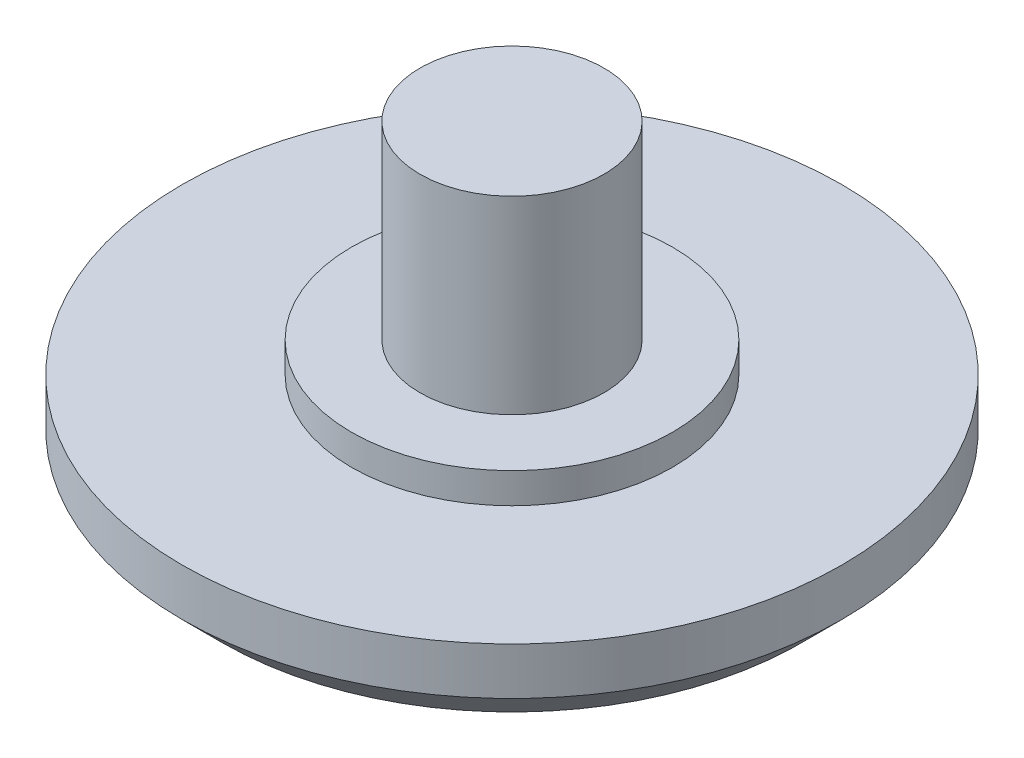
ISO-10303-21;
HEADER;
FILE_DESCRIPTION(('STEP AP214'),'2;1');
FILE_NAME('part.step','',(''),(''),'','','');
FILE_SCHEMA(('AUTOMOTIVE_DESIGN { 1 0 10303 214 1 1 1 1 }'));
ENDSEC;
DATA;
#1=APPLICATION_CONTEXT('core data for automotive mechanical design processes');
#2=APPLICATION_PROTOCOL_DEFINITION('international standard','automotive_design',2000,#1);
#3=PRODUCT_CONTEXT('',#1,'mechanical');
#4=PRODUCT('Part','Part','',(#3));
#5=PRODUCT_RELATED_PRODUCT_CATEGORY('part','',(#4));
#6=PRODUCT_DEFINITION_FORMATION('','',#4);
#7=PRODUCT_DEFINITION_CONTEXT('part definition',#1,'design');
#8=PRODUCT_DEFINITION('design','',#6,#7);
#9=PRODUCT_DEFINITION_SHAPE('','',#8);
#10=(LENGTH_UNIT() NAMED_UNIT(*) SI_UNIT(.MILLI.,.METRE.));
#11=(NAMED_UNIT(*) PLANE_ANGLE_UNIT() SI_UNIT($,.RADIAN.));
#12=(NAMED_UNIT(*) SI_UNIT($,.STERADIAN.) SOLID_ANGLE_UNIT());
#13=UNCERTAINTY_MEASURE_WITH_UNIT(LENGTH_MEASURE(1.E-05),#10,'distance_accuracy_value','');
#14=(GEOMETRIC_REPRESENTATION_CONTEXT(3) GLOBAL_UNCERTAINTY_ASSIGNED_CONTEXT((#13)) GLOBAL_UNIT_ASSIGNED_CONTEXT((#10,
#11,#12)) REPRESENTATION_CONTEXT('',''));
#15=CARTESIAN_POINT('',(0.,0.,0.));
#16=DIRECTION('',(0.,0.,1.));
#17=DIRECTION('',(1.,0.,0.));
#18=AXIS2_PLACEMENT_3D('',#15,#16,#17);
#19=CARTESIAN_POINT('',(0.,-21.0979427319702,0.));
#20=DIRECTION('',(0.,1.,0.));
#21=DIRECTION('',(0.,0.,1.));
#22=AXIS2_PLACEMENT_3D('',#19,#20,#21);
#23=CYLINDRICAL_SURFACE('',#22,2.3);
#24=CARTESIAN_POINT('',(0.,2.94,0.));
#25=DIRECTION('',(0.,1.,0.));
#26=DIRECTION('',(0.,0.,1.));
#27=AXIS2_PLACEMENT_3D('',#24,#25,#26);
#28=CIRCLE('',#27,2.3);
#29=CARTESIAN_POINT('',(0.,2.94,2.3));
#30=VERTEX_POINT('',#29);
#31=EDGE_CURVE('E62',#30,#30,#28,.F.);
#32=CARTESIAN_POINT('',(0.,7.67,0.));
#33=DIRECTION('',(0.,1.,0.));
#34=DIRECTION('',(0.,0.,1.));
#35=AXIS2_PLACEMENT_3D('',#32,#33,#34);
#36=CIRCLE('',#35,2.3);
#37=CARTESIAN_POINT('',(0.,7.67,2.3));
#38=VERTEX_POINT('',#37);
#39=EDGE_CURVE('E65',#38,#38,#36,.T.);
#40=CARTESIAN_POINT('',(0.,2.94,2.3));
#41=CARTESIAN_POINT('',(0.,2.98927083333333,2.3));
#42=CARTESIAN_POINT('',(0.,3.03854166666666,2.3));
#43=CARTESIAN_POINT('',(0.,3.13708333333333,2.3));
#44=CARTESIAN_POINT('',(0.,3.18635416666667,2.3));
#45=CARTESIAN_POINT('',(0.,3.28489583333333,2.3));
#46=CARTESIAN_POINT('',(0.,3.33416666666667,2.3));
#47=CARTESIAN_POINT('',(0.,3.43270833333333,2.3));
#48=CARTESIAN_POINT('',(0.,3.48197916666667,2.3));
#49=CARTESIAN_POINT('',(0.,3.58052083333333,2.3));
#50=CARTESIAN_POINT('',(0.,3.62979166666667,2.3));
#51=CARTESIAN_POINT('',(0.,3.72833333333333,2.3));
#52=CARTESIAN_POINT('',(0.,3.77760416666667,2.3));
#53=CARTESIAN_POINT('',(0.,3.87614583333333,2.3));
#54=CARTESIAN_POINT('',(0.,3.92541666666667,2.3));
#55=CARTESIAN_POINT('',(0.,4.02395833333333,2.3));
#56=CARTESIAN_POINT('',(0.,4.07322916666667,2.3));
#57=CARTESIAN_POINT('',(0.,4.17177083333333,2.3));
#58=CARTESIAN_POINT('',(0.,4.22104166666667,2.3));
#59=CARTESIAN_POINT('',(0.,4.31958333333333,2.3));
#60=CARTESIAN_POINT('',(0.,4.36885416666667,2.3));
#61=CARTESIAN_POINT('',(0.,4.46739583333333,2.3));
#62=CARTESIAN_POINT('',(0.,4.51666666666667,2.3));
#63=CARTESIAN_POINT('',(0.,4.61520833333333,2.3));
#64=CARTESIAN_POINT('',(0.,4.66447916666667,2.3));
#65=CARTESIAN_POINT('',(0.,4.76302083333333,2.3));
#66=CARTESIAN_POINT('',(0.,4.81229166666667,2.3));
#67=CARTESIAN_POINT('',(0.,4.91083333333333,2.3));
#68=CARTESIAN_POINT('',(0.,4.96010416666667,2.3));
#69=CARTESIAN_POINT('',(0.,5.05864583333333,2.3));
#70=CARTESIAN_POINT('',(0.,5.10791666666667,2.3));
#71=CARTESIAN_POINT('',(0.,5.20645833333333,2.3));
#72=CARTESIAN_POINT('',(0.,5.25572916666667,2.3));
#73=CARTESIAN_POINT('',(0.,5.35427083333333,2.3));
#74=CARTESIAN_POINT('',(0.,5.40354166666667,2.3));
#75=CARTESIAN_POINT('',(0.,5.50208333333333,2.3));
#76=CARTESIAN_POINT('',(0.,5.55135416666667,2.3));
#77=CARTESIAN_POINT('',(0.,5.64989583333333,2.3));
#78=CARTESIAN_POINT('',(0.,5.69916666666667,2.3));
#79=CARTESIAN_POINT('',(0.,5.79770833333334,2.3));
#80=CARTESIAN_POINT('',(0.,5.84697916666667,2.3));
#81=CARTESIAN_POINT('',(0.,5.94552083333334,2.3));
#82=CARTESIAN_POINT('',(0.,5.99479166666667,2.3));
#83=CARTESIAN_POINT('',(0.,6.09333333333334,2.3));
#84=CARTESIAN_POINT('',(0.,6.14260416666667,2.3));
#85=CARTESIAN_POINT('',(0.,6.24114583333334,2.3));
#86=CARTESIAN_POINT('',(0.,6.29041666666667,2.3));
#87=CARTESIAN_POINT('',(0.,6.38895833333334,2.3));
#88=CARTESIAN_POINT('',(0.,6.43822916666667,2.3));
#89=CARTESIAN_POINT('',(0.,6.53677083333333,2.3));
#90=CARTESIAN_POINT('',(0.,6.58604166666667,2.3));
#91=CARTESIAN_POINT('',(0.,6.68458333333334,2.3));
#92=CARTESIAN_POINT('',(0.,6.73385416666667,2.3));
#93=CARTESIAN_POINT('',(0.,6.83239583333333,2.3));
#94=CARTESIAN_POINT('',(0.,6.88166666666667,2.3));
#95=CARTESIAN_POINT('',(0.,6.98020833333333,2.3));
#96=CARTESIAN_POINT('',(0.,7.02947916666667,2.3));
#97=CARTESIAN_POINT('',(0.,7.12802083333334,2.3));
#98=CARTESIAN_POINT('',(0.,7.17729166666667,2.3));
#99=CARTESIAN_POINT('',(0.,7.27583333333334,2.3));
#100=CARTESIAN_POINT('',(0.,7.32510416666667,2.3));
#101=CARTESIAN_POINT('',(0.,7.42364583333334,2.3));
#102=CARTESIAN_POINT('',(0.,7.47291666666667,2.3));
#103=CARTESIAN_POINT('',(0.,7.57145833333334,2.3));
#104=CARTESIAN_POINT('',(0.,7.62072916666667,2.3));
#105=CARTESIAN_POINT('',(0.,7.67,2.3));
#106=B_SPLINE_CURVE_WITH_KNOTS('',3,(#40,#41,#42,#43,#44,#45,#46,#47,#48,#49,#50,#51,#52,#53,
#54,#55,#56,#57,#58,#59,#60,#61,#62,#63,#64,#65,#66,#67,#68,#69,#70,#71,#72,#73,#74,#75,#76,#77,
#78,#79,#80,#81,#82,#83,#84,#85,#86,#87,#88,#89,#90,#91,#92,#93,#94,#95,#96,#97,#98,#99,#100,
#101,#102,#103,#104,#105),.UNSPECIFIED.,.F.,.F.,(4,2,2,2,2,2,2,2,2,2,2,2,2,2,2,2,2,2,2,2,2,2,2,
2,2,2,2,2,2,2,2,2,4),(0.,0.1478125,0.295625000000001,0.443437500000001,0.591250000000001,
0.739062500000002,0.886875000000002,1.0346875,1.1825,1.3303125,1.478125,1.6259375,1.77375,
1.9215625,2.069375,2.2171875,2.365,2.5128125,2.660625,2.8084375,2.95625,3.1040625,3.251875,
3.39968750000001,3.5475,3.69531250000001,3.843125,3.9909375,4.13875,4.2865625,4.434375,
4.5821875,4.73),.UNSPECIFIED.);
#107=EDGE_CURVE('BSEAM35',#30,#38,#106,.T.);
#108=ORIENTED_EDGE('',*,*,#31,.F.);
#109=ORIENTED_EDGE('',*,*,#39,.F.);
#110=ORIENTED_EDGE('',*,*,#107,.T.);
#111=ORIENTED_EDGE('',*,*,#107,.F.);
#112=EDGE_LOOP('',(#108,#110,#109,#111));
#113=FACE_BOUND('',#112,.T.);
#114=ADVANCED_FACE('F35',(#113),#23,.T.);
#115=CARTESIAN_POINT('',(0.,3.54,0.));
#116=DIRECTION('',(0.,-1.,0.));
#117=DIRECTION('',(0.,0.,-1.));
#118=AXIS2_PLACEMENT_3D('',#115,#116,#117);
#119=CYLINDRICAL_SURFACE('',#118,4.01);
#120=CARTESIAN_POINT('',(0.,2.18,0.));
#121=DIRECTION('',(0.,1.,0.));
#122=DIRECTION('',(0.,0.,1.));
#123=AXIS2_PLACEMENT_3D('',#120,#121,#122);
#124=CIRCLE('',#123,4.01);
#125=CARTESIAN_POINT('',(0.,2.18,4.01));
#126=VERTEX_POINT('',#125);
#127=EDGE_CURVE('E11',#126,#126,#124,.T.);
#128=ORIENTED_EDGE('',*,*,#127,.T.);
#129=EDGE_LOOP('',(#128));
#130=FACE_BOUND('',#129,.T.);
#131=CARTESIAN_POINT('',(0.,2.94,0.));
#132=DIRECTION('',(0.,1.,0.));
#133=DIRECTION('',(0.,0.,1.));
#134=AXIS2_PLACEMENT_3D('',#131,#132,#133);
#135=CIRCLE('',#134,4.01);
#136=CARTESIAN_POINT('',(0.,2.94,4.01));
#137=VERTEX_POINT('',#136);
#138=EDGE_CURVE('E59',#137,#137,#135,.T.);
#139=ORIENTED_EDGE('',*,*,#138,.F.);
#140=EDGE_LOOP('',(#139));
#141=FACE_BOUND('',#140,.T.);
#142=ADVANCED_FACE('F72',(#130,#141),#119,.T.);
#143=CARTESIAN_POINT('',(0.,2.18,0.));
#144=DIRECTION('',(0.,-1.,0.));
#145=DIRECTION('',(0.,0.,-1.));
#146=AXIS2_PLACEMENT_3D('',#143,#144,#145);
#147=CYLINDRICAL_SURFACE('',#146,8.24);
#148=CARTESIAN_POINT('',(0.,2.18,0.));
#149=DIRECTION('',(0.,1.,0.));
#150=DIRECTION('',(0.,0.,1.));
#151=AXIS2_PLACEMENT_3D('',#148,#149,#150);
#152=CIRCLE('',#151,8.24);
#153=CARTESIAN_POINT('',(0.,2.18,8.24));
#154=VERTEX_POINT('',#153);
#155=EDGE_CURVE('E39',#154,#154,#152,.T.);
#156=ORIENTED_EDGE('',*,*,#155,.F.);
#157=EDGE_LOOP('',(#156));
#158=FACE_BOUND('',#157,.T.);
#159=CARTESIAN_POINT('',(0.,1.,0.));
#160=DIRECTION('',(0.,1.,0.));
#161=DIRECTION('',(0.,0.,1.));
#162=AXIS2_PLACEMENT_3D('',#159,#160,#161);
#163=CIRCLE('',#162,8.24);
#164=CARTESIAN_POINT('',(0.,1.,8.24));
#165=VERTEX_POINT('',#164);
#166=EDGE_CURVE('E53',#165,#165,#163,.T.);
#167=ORIENTED_EDGE('',*,*,#166,.T.);
#168=EDGE_LOOP('',(#167));
#169=FACE_BOUND('',#168,.T.);
#170=ADVANCED_FACE('F37',(#158,#169),#147,.T.);
#171=CARTESIAN_POINT('',(0.,2.18,0.));
#172=DIRECTION('',(0.,1.,0.));
#173=DIRECTION('',(0.,0.,1.));
#174=AXIS2_PLACEMENT_3D('',#171,#172,#173);
#175=PLANE('',#174);
#176=ORIENTED_EDGE('',*,*,#127,.F.);
#177=EDGE_LOOP('',(#176));
#178=FACE_BOUND('',#177,.T.);
#179=ORIENTED_EDGE('',*,*,#155,.T.);
#180=EDGE_LOOP('',(#179));
#181=FACE_BOUND('',#180,.T.);
#182=ADVANCED_FACE('F91',(#178,#181),#175,.T.);
#183=CARTESIAN_POINT('',(0.,1.,0.));
#184=DIRECTION('',(0.,1.,0.));
#185=DIRECTION('',(0.,0.,1.));
#186=AXIS2_PLACEMENT_3D('',#183,#184,#185);
#187=CONICAL_SURFACE('',#186,8.24,0.785398163397448);
#188=CARTESIAN_POINT('',(0.,0.,0.));
#189=DIRECTION('',(0.,1.,0.));
#190=DIRECTION('',(0.,0.,1.));
#191=AXIS2_PLACEMENT_3D('',#188,#189,#190);
#192=CIRCLE('',#191,7.24);
#193=CARTESIAN_POINT('',(0.,0.,7.24));
#194=VERTEX_POINT('',#193);
#195=EDGE_CURVE('E56',#194,#194,#192,.T.);
#196=ORIENTED_EDGE('',*,*,#195,.T.);
#197=EDGE_LOOP('',(#196));
#198=FACE_BOUND('',#197,.T.);
#199=ORIENTED_EDGE('',*,*,#166,.F.);
#200=EDGE_LOOP('',(#199));
#201=FACE_BOUND('',#200,.T.);
#202=ADVANCED_FACE('F87',(#198,#201),#187,.T.);
#203=CARTESIAN_POINT('',(0.,0.4,0.));
#204=DIRECTION('',(0.,-1.,0.));
#205=DIRECTION('',(0.,0.,-1.));
#206=AXIS2_PLACEMENT_3D('',#203,#204,#205);
#207=PLANE('',#206);
#208=CARTESIAN_POINT('',(0.,0.4,0.));
#209=DIRECTION('',(0.,1.,0.));
#210=DIRECTION('',(0.,0.,1.));
#211=AXIS2_PLACEMENT_3D('',#208,#209,#210);
#212=CIRCLE('',#211,5.6);
#213=CARTESIAN_POINT('',(0.,0.4,5.6));
#214=VERTEX_POINT('',#213);
#215=EDGE_CURVE('E46',#214,#214,#212,.T.);
#216=ORIENTED_EDGE('',*,*,#215,.F.);
#217=EDGE_LOOP('',(#216));
#218=FACE_BOUND('',#217,.T.);
#219=ADVANCED_FACE('F90',(#218),#207,.T.);
#220=CARTESIAN_POINT('',(0.,0.,0.));
#221=DIRECTION('',(0.,-1.,0.));
#222=DIRECTION('',(0.,0.,-1.));
#223=AXIS2_PLACEMENT_3D('',#220,#221,#222);
#224=CONICAL_SURFACE('',#223,6.6,1.19028994968253);
#225=ORIENTED_EDGE('',*,*,#215,.T.);
#226=EDGE_LOOP('',(#225));
#227=FACE_BOUND('',#226,.T.);
#228=CARTESIAN_POINT('',(0.,0.,0.));
#229=DIRECTION('',(0.,1.,0.));
#230=DIRECTION('',(0.,0.,1.));
#231=AXIS2_PLACEMENT_3D('',#228,#229,#230);
#232=CIRCLE('',#231,6.6);
#233=CARTESIAN_POINT('',(0.,0.,6.6));
#234=VERTEX_POINT('',#233);
#235=EDGE_CURVE('E50',#234,#234,#232,.T.);
#236=ORIENTED_EDGE('',*,*,#235,.F.);
#237=EDGE_LOOP('',(#236));
#238=FACE_BOUND('',#237,.T.);
#239=ADVANCED_FACE('F93',(#227,#238),#224,.F.);
#240=CARTESIAN_POINT('',(0.,0.,0.));
#241=DIRECTION('',(0.,1.,0.));
#242=DIRECTION('',(0.,0.,1.));
#243=AXIS2_PLACEMENT_3D('',#240,#241,#242);
#244=PLANE('',#243);
#245=ORIENTED_EDGE('',*,*,#235,.T.);
#246=EDGE_LOOP('',(#245));
#247=FACE_BOUND('',#246,.T.);
#248=ORIENTED_EDGE('',*,*,#195,.F.);
#249=EDGE_LOOP('',(#248));
#250=FACE_BOUND('',#249,.T.);
#251=ADVANCED_FACE('F85',(#247,#250),#244,.F.);
#252=CARTESIAN_POINT('',(0.,2.94,0.));
#253=DIRECTION('',(0.,1.,0.));
#254=DIRECTION('',(0.,0.,1.));
#255=AXIS2_PLACEMENT_3D('',#252,#253,#254);
#256=PLANE('',#255);
#257=ORIENTED_EDGE('',*,*,#138,.T.);
#258=EDGE_LOOP('',(#257));
#259=FACE_BOUND('',#258,.T.);
#260=ORIENTED_EDGE('',*,*,#31,.T.);
#261=EDGE_LOOP('',(#260));
#262=FACE_BOUND('',#261,.T.);
#263=ADVANCED_FACE('F82',(#259,#262),#256,.T.);
#264=CARTESIAN_POINT('',(0.,7.67,0.));
#265=DIRECTION('',(0.,1.,0.));
#266=DIRECTION('',(0.,0.,1.));
#267=AXIS2_PLACEMENT_3D('',#264,#265,#266);
#268=PLANE('',#267);
#269=ORIENTED_EDGE('',*,*,#39,.T.);
#270=EDGE_LOOP('',(#269));
#271=FACE_BOUND('',#270,.T.);
#272=ADVANCED_FACE('F69',(#271),#268,.T.);
#273=CLOSED_SHELL('',(#114,#142,#170,#182,#202,#219,#239,#251,#263,#272));
#274=MANIFOLD_SOLID_BREP('B2',#273);
#275=ADVANCED_BREP_SHAPE_REPRESENTATION('',(#18,#274),#14);
#276=SHAPE_DEFINITION_REPRESENTATION(#9,#275);
ENDSEC;
END-ISO-10303-21;
